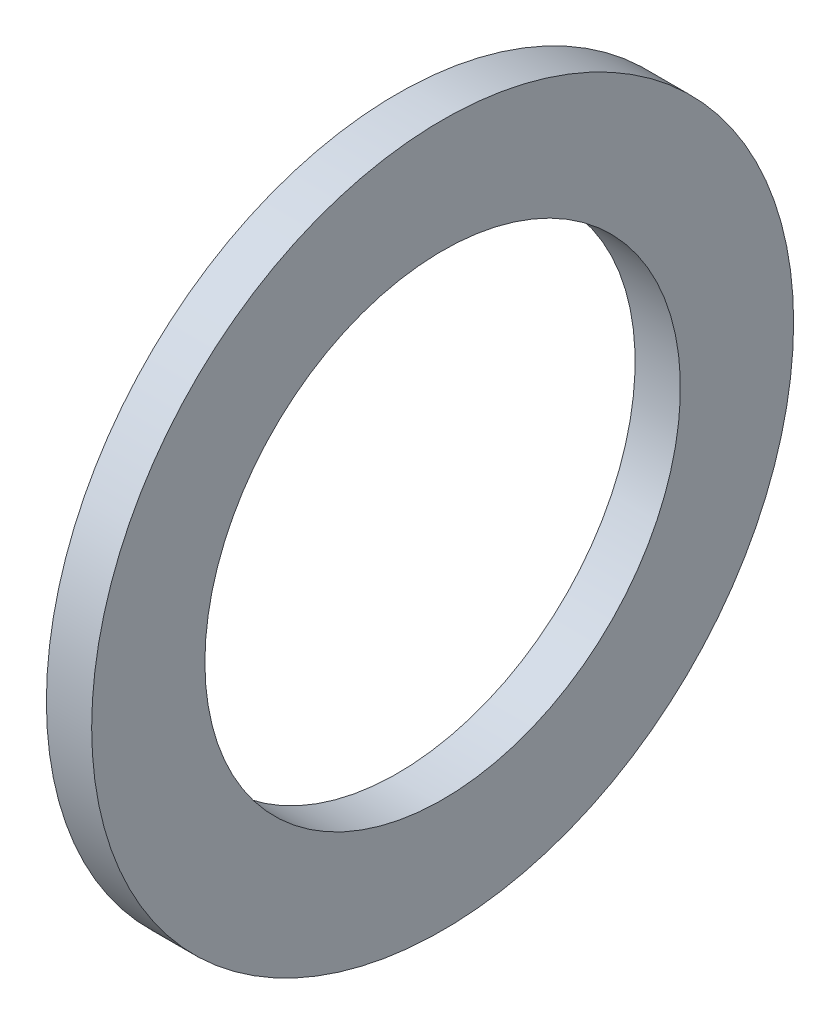
ISO-10303-21;
HEADER;
FILE_DESCRIPTION(('STEP AP214'),'2;1');
FILE_NAME('part.step','',(''),(''),'','','');
FILE_SCHEMA(('AUTOMOTIVE_DESIGN { 1 0 10303 214 1 1 1 1 }'));
ENDSEC;
DATA;
#1=APPLICATION_CONTEXT('core data for automotive mechanical design processes');
#2=APPLICATION_PROTOCOL_DEFINITION('international standard','automotive_design',2000,#1);
#3=PRODUCT_CONTEXT('',#1,'mechanical');
#4=PRODUCT('Part','Part','',(#3));
#5=PRODUCT_RELATED_PRODUCT_CATEGORY('part','',(#4));
#6=PRODUCT_DEFINITION_FORMATION('','',#4);
#7=PRODUCT_DEFINITION_CONTEXT('part definition',#1,'design');
#8=PRODUCT_DEFINITION('design','',#6,#7);
#9=PRODUCT_DEFINITION_SHAPE('','',#8);
#10=(LENGTH_UNIT() NAMED_UNIT(*) SI_UNIT(.MILLI.,.METRE.));
#11=(NAMED_UNIT(*) PLANE_ANGLE_UNIT() SI_UNIT($,.RADIAN.));
#12=(NAMED_UNIT(*) SI_UNIT($,.STERADIAN.) SOLID_ANGLE_UNIT());
#13=UNCERTAINTY_MEASURE_WITH_UNIT(LENGTH_MEASURE(1.E-05),#10,'distance_accuracy_value','');
#14=(GEOMETRIC_REPRESENTATION_CONTEXT(3) GLOBAL_UNCERTAINTY_ASSIGNED_CONTEXT((#13)) GLOBAL_UNIT_ASSIGNED_CONTEXT((#10,
#11,#12)) REPRESENTATION_CONTEXT('',''));
#15=CARTESIAN_POINT('',(0.,0.,0.));
#16=DIRECTION('',(0.,0.,1.));
#17=DIRECTION('',(1.,0.,0.));
#18=AXIS2_PLACEMENT_3D('',#15,#16,#17);
#19=CARTESIAN_POINT('',(-34.9249999999999,0.,0.));
#20=DIRECTION('',(-1.,0.,0.));
#21=DIRECTION('',(0.,0.,1.));
#22=AXIS2_PLACEMENT_3D('',#19,#20,#21);
#23=CYLINDRICAL_SURFACE('',#22,10.5);
#24=CARTESIAN_POINT('',(0.,0.,0.));
#25=DIRECTION('',(-1.,0.,0.));
#26=DIRECTION('',(0.,0.,1.));
#27=AXIS2_PLACEMENT_3D('',#24,#25,#26);
#28=CIRCLE('',#27,10.5);
#29=CARTESIAN_POINT('',(0.,0.,10.5));
#30=VERTEX_POINT('',#29);
#31=EDGE_CURVE('E10',#30,#30,#28,.T.);
#32=ORIENTED_EDGE('',*,*,#31,.F.);
#33=EDGE_LOOP('',(#32));
#34=FACE_BOUND('',#33,.T.);
#35=CARTESIAN_POINT('',(-2.,0.,0.));
#36=DIRECTION('',(-1.,0.,0.));
#37=DIRECTION('',(0.,0.,1.));
#38=AXIS2_PLACEMENT_3D('',#35,#36,#37);
#39=CIRCLE('',#38,10.5);
#40=CARTESIAN_POINT('',(-2.,0.,10.5));
#41=VERTEX_POINT('',#40);
#42=EDGE_CURVE('E44',#41,#41,#39,.T.);
#43=ORIENTED_EDGE('',*,*,#42,.T.);
#44=EDGE_LOOP('',(#43));
#45=FACE_BOUND('',#44,.T.);
#46=ADVANCED_FACE('F30',(#34,#45),#23,.F.);
#47=CARTESIAN_POINT('',(0.,10.5,0.));
#48=DIRECTION('',(-1.,0.,0.));
#49=DIRECTION('',(0.,0.,1.));
#50=AXIS2_PLACEMENT_3D('',#47,#48,#49);
#51=PLANE('',#50);
#52=CARTESIAN_POINT('',(0.,0.,0.));
#53=DIRECTION('',(-1.,0.,0.));
#54=DIRECTION('',(0.,0.,1.));
#55=AXIS2_PLACEMENT_3D('',#52,#53,#54);
#56=CIRCLE('',#55,15.5);
#57=CARTESIAN_POINT('',(0.,0.,15.5));
#58=VERTEX_POINT('',#57);
#59=EDGE_CURVE('E36',#58,#58,#56,.T.);
#60=ORIENTED_EDGE('',*,*,#59,.F.);
#61=EDGE_LOOP('',(#60));
#62=FACE_BOUND('',#61,.T.);
#63=ORIENTED_EDGE('',*,*,#31,.T.);
#64=EDGE_LOOP('',(#63));
#65=FACE_BOUND('',#64,.T.);
#66=ADVANCED_FACE('F59',(#62,#65),#51,.F.);
#67=CARTESIAN_POINT('',(-34.9249999999999,0.,0.));
#68=DIRECTION('',(-1.,0.,0.));
#69=DIRECTION('',(0.,0.,1.));
#70=AXIS2_PLACEMENT_3D('',#67,#68,#69);
#71=CYLINDRICAL_SURFACE('',#70,15.5);
#72=CARTESIAN_POINT('',(-2.,0.,0.));
#73=DIRECTION('',(-1.,0.,0.));
#74=DIRECTION('',(0.,0.,1.));
#75=AXIS2_PLACEMENT_3D('',#72,#73,#74);
#76=CIRCLE('',#75,15.5);
#77=CARTESIAN_POINT('',(-2.,0.,15.5));
#78=VERTEX_POINT('',#77);
#79=EDGE_CURVE('E40',#78,#78,#76,.T.);
#80=ORIENTED_EDGE('',*,*,#79,.F.);
#81=EDGE_LOOP('',(#80));
#82=FACE_BOUND('',#81,.T.);
#83=ORIENTED_EDGE('',*,*,#59,.T.);
#84=EDGE_LOOP('',(#83));
#85=FACE_BOUND('',#84,.T.);
#86=ADVANCED_FACE('F54',(#82,#85),#71,.T.);
#87=CARTESIAN_POINT('',(-2.,15.5,0.));
#88=DIRECTION('',(1.,0.,0.));
#89=DIRECTION('',(0.,0.,-1.));
#90=AXIS2_PLACEMENT_3D('',#87,#88,#89);
#91=PLANE('',#90);
#92=ORIENTED_EDGE('',*,*,#42,.F.);
#93=EDGE_LOOP('',(#92));
#94=FACE_BOUND('',#93,.T.);
#95=ORIENTED_EDGE('',*,*,#79,.T.);
#96=EDGE_LOOP('',(#95));
#97=FACE_BOUND('',#96,.T.);
#98=ADVANCED_FACE('F51',(#94,#97),#91,.F.);
#99=CLOSED_SHELL('',(#46,#66,#86,#98));
#100=MANIFOLD_SOLID_BREP('B2',#99);
#101=ADVANCED_BREP_SHAPE_REPRESENTATION('',(#18,#100),#14);
#102=SHAPE_DEFINITION_REPRESENTATION(#9,#101);
ENDSEC;
END-ISO-10303-21;
